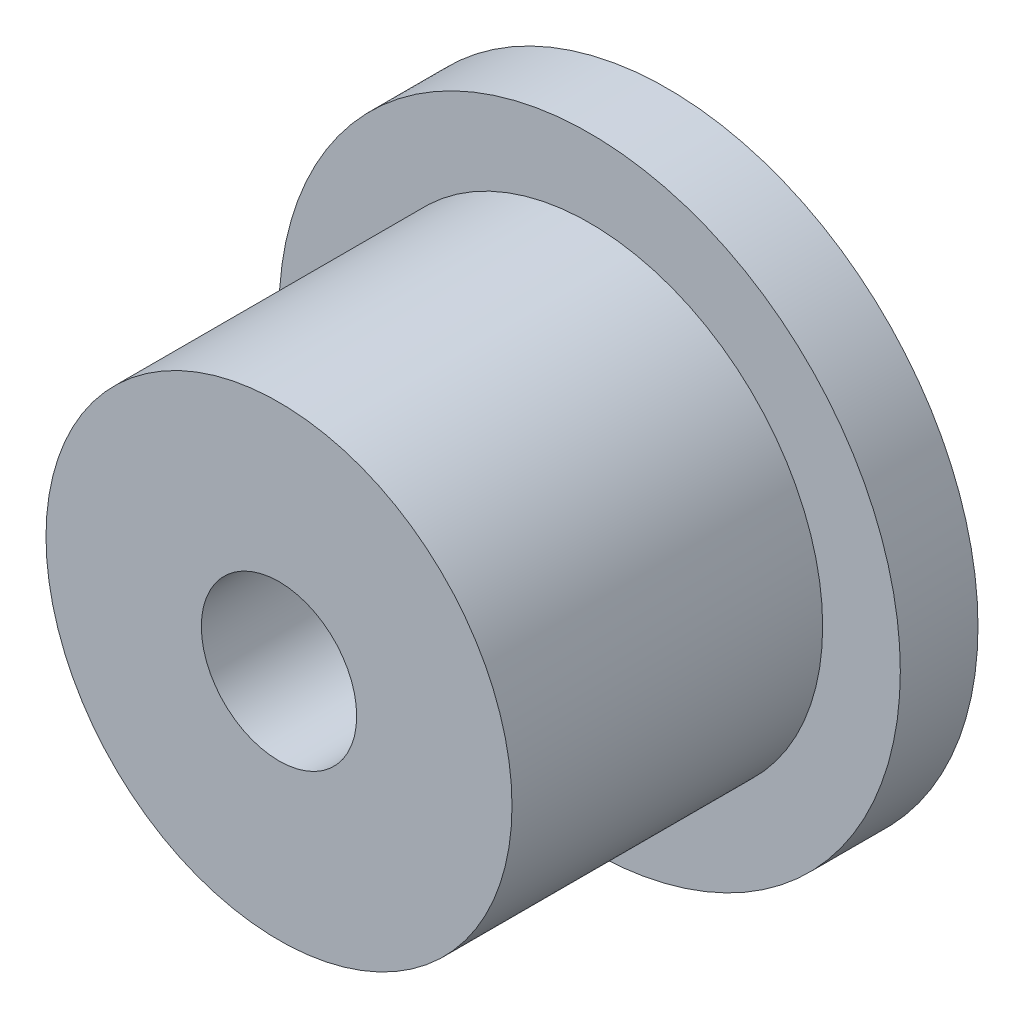
ISO-10303-21;
HEADER;
FILE_DESCRIPTION(('STEP AP214'),'2;1');
FILE_NAME('part.step','',(''),(''),'','','');
FILE_SCHEMA(('AUTOMOTIVE_DESIGN { 1 0 10303 214 1 1 1 1 }'));
ENDSEC;
DATA;
#1=APPLICATION_CONTEXT('core data for automotive mechanical design processes');
#2=APPLICATION_PROTOCOL_DEFINITION('international standard','automotive_design',2000,#1);
#3=PRODUCT_CONTEXT('',#1,'mechanical');
#4=PRODUCT('Part','Part','',(#3));
#5=PRODUCT_RELATED_PRODUCT_CATEGORY('part','',(#4));
#6=PRODUCT_DEFINITION_FORMATION('','',#4);
#7=PRODUCT_DEFINITION_CONTEXT('part definition',#1,'design');
#8=PRODUCT_DEFINITION('design','',#6,#7);
#9=PRODUCT_DEFINITION_SHAPE('','',#8);
#10=(LENGTH_UNIT() NAMED_UNIT(*) SI_UNIT(.MILLI.,.METRE.));
#11=(NAMED_UNIT(*) PLANE_ANGLE_UNIT() SI_UNIT($,.RADIAN.));
#12=(NAMED_UNIT(*) SI_UNIT($,.STERADIAN.) SOLID_ANGLE_UNIT());
#13=UNCERTAINTY_MEASURE_WITH_UNIT(LENGTH_MEASURE(1.E-05),#10,'distance_accuracy_value','');
#14=(GEOMETRIC_REPRESENTATION_CONTEXT(3) GLOBAL_UNCERTAINTY_ASSIGNED_CONTEXT((#13)) GLOBAL_UNIT_ASSIGNED_CONTEXT((#10,
#11,#12)) REPRESENTATION_CONTEXT('',''));
#15=CARTESIAN_POINT('',(0.,0.,0.));
#16=DIRECTION('',(0.,0.,1.));
#17=DIRECTION('',(1.,0.,0.));
#18=AXIS2_PLACEMENT_3D('',#15,#16,#17);
#19=CARTESIAN_POINT('',(0.,0.,100.));
#20=DIRECTION('',(0.,0.,1.));
#21=DIRECTION('',(1.,0.,0.));
#22=AXIS2_PLACEMENT_3D('',#19,#20,#21);
#23=PLANE('',#22);
#24=CARTESIAN_POINT('',(0.,0.,100.));
#25=DIRECTION('',(0.,0.,1.));
#26=DIRECTION('',(1.,0.,0.));
#27=AXIS2_PLACEMENT_3D('',#24,#25,#26);
#28=CIRCLE('',#27,75.);
#29=CARTESIAN_POINT('',(75.,0.,100.));
#30=VERTEX_POINT('',#29);
#31=EDGE_CURVE('E10',#30,#30,#28,.T.);
#32=ORIENTED_EDGE('',*,*,#31,.T.);
#33=EDGE_LOOP('',(#32));
#34=FACE_BOUND('',#33,.T.);
#35=CARTESIAN_POINT('',(0.,0.,100.));
#36=DIRECTION('',(0.,0.,1.));
#37=DIRECTION('',(1.,0.,0.));
#38=AXIS2_PLACEMENT_3D('',#35,#36,#37);
#39=CIRCLE('',#38,25.);
#40=CARTESIAN_POINT('',(25.,0.,100.));
#41=VERTEX_POINT('',#40);
#42=EDGE_CURVE('E43',#41,#41,#39,.T.);
#43=ORIENTED_EDGE('',*,*,#42,.F.);
#44=EDGE_LOOP('',(#43));
#45=FACE_BOUND('',#44,.T.);
#46=ADVANCED_FACE('F35',(#34,#45),#23,.T.);
#47=CARTESIAN_POINT('',(0.,0.,100.));
#48=DIRECTION('',(0.,0.,-1.));
#49=DIRECTION('',(-1.,0.,0.));
#50=AXIS2_PLACEMENT_3D('',#47,#48,#49);
#51=CYLINDRICAL_SURFACE('',#50,75.);
#52=ORIENTED_EDGE('',*,*,#31,.F.);
#53=EDGE_LOOP('',(#52));
#54=FACE_BOUND('',#53,.T.);
#55=CARTESIAN_POINT('',(0.,0.,0.));
#56=DIRECTION('',(0.,0.,1.));
#57=DIRECTION('',(1.,0.,0.));
#58=AXIS2_PLACEMENT_3D('',#55,#56,#57);
#59=CIRCLE('',#58,75.);
#60=CARTESIAN_POINT('',(75.,0.,0.));
#61=VERTEX_POINT('',#60);
#62=EDGE_CURVE('E39',#61,#61,#59,.T.);
#63=ORIENTED_EDGE('',*,*,#62,.T.);
#64=EDGE_LOOP('',(#63));
#65=FACE_BOUND('',#64,.T.);
#66=ADVANCED_FACE('F37',(#54,#65),#51,.T.);
#67=CARTESIAN_POINT('',(0.,0.,100.));
#68=DIRECTION('',(0.,0.,-1.));
#69=DIRECTION('',(-1.,0.,0.));
#70=AXIS2_PLACEMENT_3D('',#67,#68,#69);
#71=CYLINDRICAL_SURFACE('',#70,25.);
#72=ORIENTED_EDGE('',*,*,#42,.T.);
#73=EDGE_LOOP('',(#72));
#74=FACE_BOUND('',#73,.T.);
#75=CARTESIAN_POINT('',(0.,0.,-25.));
#76=DIRECTION('',(0.,0.,-1.));
#77=DIRECTION('',(-1.,0.,0.));
#78=AXIS2_PLACEMENT_3D('',#75,#76,#77);
#79=CIRCLE('',#78,25.);
#80=CARTESIAN_POINT('',(-25.,0.,-25.));
#81=VERTEX_POINT('',#80);
#82=EDGE_CURVE('E53',#81,#81,#79,.T.);
#83=ORIENTED_EDGE('',*,*,#82,.T.);
#84=EDGE_LOOP('',(#83));
#85=FACE_BOUND('',#84,.T.);
#86=ADVANCED_FACE('F59',(#74,#85),#71,.F.);
#87=CARTESIAN_POINT('',(0.,0.,-25.));
#88=DIRECTION('',(0.,0.,-1.));
#89=DIRECTION('',(-1.,0.,0.));
#90=AXIS2_PLACEMENT_3D('',#87,#88,#89);
#91=PLANE('',#90);
#92=CARTESIAN_POINT('',(0.,0.,-25.));
#93=DIRECTION('',(0.,0.,-1.));
#94=DIRECTION('',(-1.,0.,0.));
#95=AXIS2_PLACEMENT_3D('',#92,#93,#94);
#96=CIRCLE('',#95,100.);
#97=CARTESIAN_POINT('',(-100.,0.,-25.));
#98=VERTEX_POINT('',#97);
#99=EDGE_CURVE('E52',#98,#98,#96,.T.);
#100=ORIENTED_EDGE('',*,*,#99,.T.);
#101=EDGE_LOOP('',(#100));
#102=FACE_BOUND('',#101,.T.);
#103=ORIENTED_EDGE('',*,*,#82,.F.);
#104=EDGE_LOOP('',(#103));
#105=FACE_BOUND('',#104,.T.);
#106=ADVANCED_FACE('F61',(#102,#105),#91,.T.);
#107=CARTESIAN_POINT('',(0.,0.,0.));
#108=DIRECTION('',(0.,0.,-1.));
#109=DIRECTION('',(-1.,0.,0.));
#110=AXIS2_PLACEMENT_3D('',#107,#108,#109);
#111=PLANE('',#110);
#112=ORIENTED_EDGE('',*,*,#62,.F.);
#113=EDGE_LOOP('',(#112));
#114=FACE_BOUND('',#113,.T.);
#115=CARTESIAN_POINT('',(0.,0.,0.));
#116=DIRECTION('',(0.,0.,-1.));
#117=DIRECTION('',(-1.,0.,0.));
#118=AXIS2_PLACEMENT_3D('',#115,#116,#117);
#119=CIRCLE('',#118,100.);
#120=CARTESIAN_POINT('',(-100.,0.,0.));
#121=VERTEX_POINT('',#120);
#122=EDGE_CURVE('E49',#121,#121,#119,.T.);
#123=ORIENTED_EDGE('',*,*,#122,.F.);
#124=EDGE_LOOP('',(#123));
#125=FACE_BOUND('',#124,.T.);
#126=ADVANCED_FACE('F63',(#114,#125),#111,.F.);
#127=CARTESIAN_POINT('',(0.,0.,-25.));
#128=DIRECTION('',(0.,0.,1.));
#129=DIRECTION('',(1.,0.,0.));
#130=AXIS2_PLACEMENT_3D('',#127,#128,#129);
#131=CYLINDRICAL_SURFACE('',#130,100.);
#132=ORIENTED_EDGE('',*,*,#99,.F.);
#133=EDGE_LOOP('',(#132));
#134=FACE_BOUND('',#133,.T.);
#135=ORIENTED_EDGE('',*,*,#122,.T.);
#136=EDGE_LOOP('',(#135));
#137=FACE_BOUND('',#136,.T.);
#138=ADVANCED_FACE('F70',(#134,#137),#131,.T.);
#139=CLOSED_SHELL('',(#46,#66,#86,#106,#126,#138));
#140=MANIFOLD_SOLID_BREP('B2',#139);
#141=ADVANCED_BREP_SHAPE_REPRESENTATION('',(#18,#140),#14);
#142=SHAPE_DEFINITION_REPRESENTATION(#9,#141);
ENDSEC;
END-ISO-10303-21;
